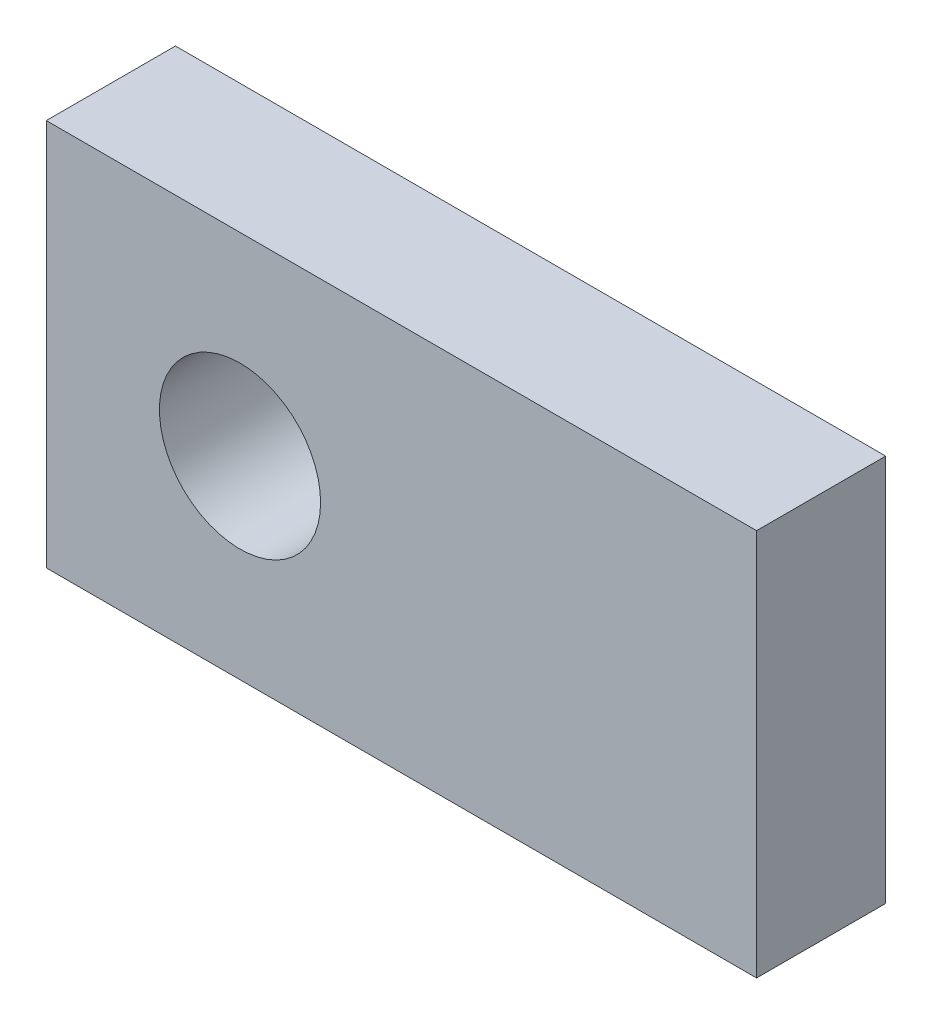
ISO-10303-21;
HEADER;
FILE_DESCRIPTION(('STEP AP214'),'2;1');
FILE_NAME('part.step','',(''),(''),'','','');
FILE_SCHEMA(('AUTOMOTIVE_DESIGN { 1 0 10303 214 1 1 1 1 }'));
ENDSEC;
DATA;
#1=APPLICATION_CONTEXT('core data for automotive mechanical design processes');
#2=APPLICATION_PROTOCOL_DEFINITION('international standard','automotive_design',2000,#1);
#3=PRODUCT_CONTEXT('',#1,'mechanical');
#4=PRODUCT('Part','Part','',(#3));
#5=PRODUCT_RELATED_PRODUCT_CATEGORY('part','',(#4));
#6=PRODUCT_DEFINITION_FORMATION('','',#4);
#7=PRODUCT_DEFINITION_CONTEXT('part definition',#1,'design');
#8=PRODUCT_DEFINITION('design','',#6,#7);
#9=PRODUCT_DEFINITION_SHAPE('','',#8);
#10=(LENGTH_UNIT() NAMED_UNIT(*) SI_UNIT(.MILLI.,.METRE.));
#11=(NAMED_UNIT(*) PLANE_ANGLE_UNIT() SI_UNIT($,.RADIAN.));
#12=(NAMED_UNIT(*) SI_UNIT($,.STERADIAN.) SOLID_ANGLE_UNIT());
#13=UNCERTAINTY_MEASURE_WITH_UNIT(LENGTH_MEASURE(1.E-05),#10,'distance_accuracy_value','');
#14=(GEOMETRIC_REPRESENTATION_CONTEXT(3) GLOBAL_UNCERTAINTY_ASSIGNED_CONTEXT((#13)) GLOBAL_UNIT_ASSIGNED_CONTEXT((#10,
#11,#12)) REPRESENTATION_CONTEXT('',''));
#15=CARTESIAN_POINT('',(0.,0.,0.));
#16=DIRECTION('',(0.,0.,1.));
#17=DIRECTION('',(1.,0.,0.));
#18=AXIS2_PLACEMENT_3D('',#15,#16,#17);
#19=CARTESIAN_POINT('',(0.,0.,6.35));
#20=DIRECTION('',(0.,0.,1.));
#21=DIRECTION('',(1.,0.,0.));
#22=AXIS2_PLACEMENT_3D('',#19,#20,#21);
#23=PLANE('',#22);
#24=DIRECTION('',(0.,-1.,0.));
#25=VECTOR('',#24,1.);
#26=CARTESIAN_POINT('',(-17.4625,-9.525,6.35));
#27=LINE('',#26,#25);
#28=CARTESIAN_POINT('',(-17.4625,9.525,6.35));
#29=VERTEX_POINT('',#28);
#30=CARTESIAN_POINT('',(-17.4625,-9.525,6.35));
#31=VERTEX_POINT('',#30);
#32=EDGE_CURVE('E85',#29,#31,#27,.T.);
#33=ORIENTED_EDGE('',*,*,#32,.T.);
#34=DIRECTION('',(1.,0.,0.));
#35=VECTOR('',#34,1.);
#36=CARTESIAN_POINT('',(17.4625,-9.525,6.35));
#37=LINE('',#36,#35);
#38=CARTESIAN_POINT('',(17.4625,-9.525,6.35));
#39=VERTEX_POINT('',#38);
#40=EDGE_CURVE('E80',#31,#39,#37,.T.);
#41=ORIENTED_EDGE('',*,*,#40,.T.);
#42=DIRECTION('',(0.,1.,0.));
#43=VECTOR('',#42,1.);
#44=CARTESIAN_POINT('',(17.4625,-9.525,6.35));
#45=LINE('',#44,#43);
#46=CARTESIAN_POINT('',(17.4625,9.525,6.35));
#47=VERTEX_POINT('',#46);
#48=EDGE_CURVE('E83',#39,#47,#45,.T.);
#49=ORIENTED_EDGE('',*,*,#48,.T.);
#50=DIRECTION('',(-1.,0.,0.));
#51=VECTOR('',#50,1.);
#52=CARTESIAN_POINT('',(17.4625,9.525,6.35));
#53=LINE('',#52,#51);
#54=EDGE_CURVE('E50',#47,#29,#53,.T.);
#55=ORIENTED_EDGE('',*,*,#54,.T.);
#56=EDGE_LOOP('',(#33,#41,#49,#55));
#57=FACE_BOUND('',#56,.T.);
#58=CARTESIAN_POINT('',(-7.9375,0.,6.35));
#59=DIRECTION('',(0.,0.,1.));
#60=DIRECTION('',(1.,0.,0.));
#61=AXIS2_PLACEMENT_3D('',#58,#59,#60);
#62=CIRCLE('',#61,3.9624);
#63=CARTESIAN_POINT('',(-3.9751,0.,6.35));
#64=VERTEX_POINT('',#63);
#65=EDGE_CURVE('E100',#64,#64,#62,.T.);
#66=ORIENTED_EDGE('',*,*,#65,.F.);
#67=EDGE_LOOP('',(#66));
#68=FACE_BOUND('',#67,.T.);
#69=ADVANCED_FACE('F33',(#57,#68),#23,.T.);
#70=CARTESIAN_POINT('',(0.,0.,0.));
#71=DIRECTION('',(0.,0.,1.));
#72=DIRECTION('',(1.,0.,0.));
#73=AXIS2_PLACEMENT_3D('',#70,#71,#72);
#74=PLANE('',#73);
#75=DIRECTION('',(0.,-1.,0.));
#76=VECTOR('',#75,1.);
#77=CARTESIAN_POINT('',(-17.4625,-9.525,0.));
#78=LINE('',#77,#76);
#79=CARTESIAN_POINT('',(-17.4625,9.525,0.));
#80=VERTEX_POINT('',#79);
#81=CARTESIAN_POINT('',(-17.4625,-9.525,0.));
#82=VERTEX_POINT('',#81);
#83=EDGE_CURVE('E97',#80,#82,#78,.T.);
#84=ORIENTED_EDGE('',*,*,#83,.F.);
#85=DIRECTION('',(-1.,0.,0.));
#86=VECTOR('',#85,1.);
#87=CARTESIAN_POINT('',(17.4625,9.525,0.));
#88=LINE('',#87,#86);
#89=CARTESIAN_POINT('',(17.4625,9.525,0.));
#90=VERTEX_POINT('',#89);
#91=EDGE_CURVE('E73',#90,#80,#88,.T.);
#92=ORIENTED_EDGE('',*,*,#91,.F.);
#93=DIRECTION('',(0.,1.,0.));
#94=VECTOR('',#93,1.);
#95=CARTESIAN_POINT('',(17.4625,-9.525,0.));
#96=LINE('',#95,#94);
#97=CARTESIAN_POINT('',(17.4625,-9.525,0.));
#98=VERTEX_POINT('',#97);
#99=EDGE_CURVE('E67',#98,#90,#96,.T.);
#100=ORIENTED_EDGE('',*,*,#99,.F.);
#101=DIRECTION('',(1.,0.,0.));
#102=VECTOR('',#101,1.);
#103=CARTESIAN_POINT('',(17.4625,-9.525,0.));
#104=LINE('',#103,#102);
#105=EDGE_CURVE('E89',#82,#98,#104,.T.);
#106=ORIENTED_EDGE('',*,*,#105,.F.);
#107=EDGE_LOOP('',(#84,#92,#100,#106));
#108=FACE_BOUND('',#107,.T.);
#109=CARTESIAN_POINT('',(-7.9375,0.,0.));
#110=DIRECTION('',(0.,0.,1.));
#111=DIRECTION('',(1.,0.,0.));
#112=AXIS2_PLACEMENT_3D('',#109,#110,#111);
#113=CIRCLE('',#112,3.9624);
#114=CARTESIAN_POINT('',(-3.9751,0.,0.));
#115=VERTEX_POINT('',#114);
#116=EDGE_CURVE('E112',#115,#115,#113,.T.);
#117=ORIENTED_EDGE('',*,*,#116,.T.);
#118=EDGE_LOOP('',(#117));
#119=FACE_BOUND('',#118,.T.);
#120=ADVANCED_FACE('F108',(#108,#119),#74,.F.);
#121=CARTESIAN_POINT('',(-17.4625,-9.525,6.35));
#122=DIRECTION('',(1.,0.,0.));
#123=DIRECTION('',(0.,0.,-1.));
#124=AXIS2_PLACEMENT_3D('',#121,#122,#123);
#125=PLANE('',#124);
#126=ORIENTED_EDGE('',*,*,#83,.T.);
#127=DIRECTION('',(0.,0.,-1.));
#128=VECTOR('',#127,1.);
#129=CARTESIAN_POINT('',(-17.4625,-9.525,6.35));
#130=LINE('',#129,#128);
#131=EDGE_CURVE('E11',#31,#82,#130,.T.);
#132=ORIENTED_EDGE('',*,*,#131,.F.);
#133=ORIENTED_EDGE('',*,*,#32,.F.);
#134=DIRECTION('',(0.,0.,-1.));
#135=VECTOR('',#134,1.);
#136=CARTESIAN_POINT('',(-17.4625,9.525,6.35));
#137=LINE('',#136,#135);
#138=EDGE_CURVE('E93',#29,#80,#137,.T.);
#139=ORIENTED_EDGE('',*,*,#138,.T.);
#140=EDGE_LOOP('',(#126,#132,#133,#139));
#141=FACE_BOUND('',#140,.T.);
#142=ADVANCED_FACE('F35',(#141),#125,.F.);
#143=CARTESIAN_POINT('',(17.4625,-9.525,6.35));
#144=DIRECTION('',(0.,1.,0.));
#145=DIRECTION('',(-1.,0.,0.));
#146=AXIS2_PLACEMENT_3D('',#143,#144,#145);
#147=PLANE('',#146);
#148=ORIENTED_EDGE('',*,*,#105,.T.);
#149=DIRECTION('',(0.,0.,-1.));
#150=VECTOR('',#149,1.);
#151=CARTESIAN_POINT('',(17.4625,-9.525,6.35));
#152=LINE('',#151,#150);
#153=EDGE_CURVE('E42',#39,#98,#152,.T.);
#154=ORIENTED_EDGE('',*,*,#153,.F.);
#155=ORIENTED_EDGE('',*,*,#40,.F.);
#156=ORIENTED_EDGE('',*,*,#131,.T.);
#157=EDGE_LOOP('',(#148,#154,#155,#156));
#158=FACE_BOUND('',#157,.T.);
#159=ADVANCED_FACE('F88',(#158),#147,.F.);
#160=CARTESIAN_POINT('',(17.4625,-9.525,6.35));
#161=DIRECTION('',(-1.,0.,0.));
#162=DIRECTION('',(0.,0.,1.));
#163=AXIS2_PLACEMENT_3D('',#160,#161,#162);
#164=PLANE('',#163);
#165=ORIENTED_EDGE('',*,*,#99,.T.);
#166=DIRECTION('',(0.,0.,-1.));
#167=VECTOR('',#166,1.);
#168=CARTESIAN_POINT('',(17.4625,9.525,6.35));
#169=LINE('',#168,#167);
#170=EDGE_CURVE('E90',#47,#90,#169,.T.);
#171=ORIENTED_EDGE('',*,*,#170,.F.);
#172=ORIENTED_EDGE('',*,*,#48,.F.);
#173=ORIENTED_EDGE('',*,*,#153,.T.);
#174=EDGE_LOOP('',(#165,#171,#172,#173));
#175=FACE_BOUND('',#174,.T.);
#176=ADVANCED_FACE('F91',(#175),#164,.F.);
#177=CARTESIAN_POINT('',(17.4625,9.525,6.35));
#178=DIRECTION('',(0.,-1.,0.));
#179=DIRECTION('',(1.,0.,0.));
#180=AXIS2_PLACEMENT_3D('',#177,#178,#179);
#181=PLANE('',#180);
#182=ORIENTED_EDGE('',*,*,#91,.T.);
#183=ORIENTED_EDGE('',*,*,#138,.F.);
#184=ORIENTED_EDGE('',*,*,#54,.F.);
#185=ORIENTED_EDGE('',*,*,#170,.T.);
#186=EDGE_LOOP('',(#182,#183,#184,#185));
#187=FACE_BOUND('',#186,.T.);
#188=ADVANCED_FACE('F105',(#187),#181,.F.);
#189=CARTESIAN_POINT('',(-7.9375,0.,6.35));
#190=DIRECTION('',(0.,0.,-1.));
#191=DIRECTION('',(-1.,0.,0.));
#192=AXIS2_PLACEMENT_3D('',#189,#190,#191);
#193=CYLINDRICAL_SURFACE('',#192,3.9624);
#194=ORIENTED_EDGE('',*,*,#65,.T.);
#195=EDGE_LOOP('',(#194));
#196=FACE_BOUND('',#195,.T.);
#197=ORIENTED_EDGE('',*,*,#116,.F.);
#198=EDGE_LOOP('',(#197));
#199=FACE_BOUND('',#198,.T.);
#200=ADVANCED_FACE('F118',(#196,#199),#193,.F.);
#201=CLOSED_SHELL('',(#69,#120,#142,#159,#176,#188,#200));
#202=MANIFOLD_SOLID_BREP('B2',#201);
#203=ADVANCED_BREP_SHAPE_REPRESENTATION('',(#18,#202),#14);
#204=SHAPE_DEFINITION_REPRESENTATION(#9,#203);
ENDSEC;
END-ISO-10303-21;
